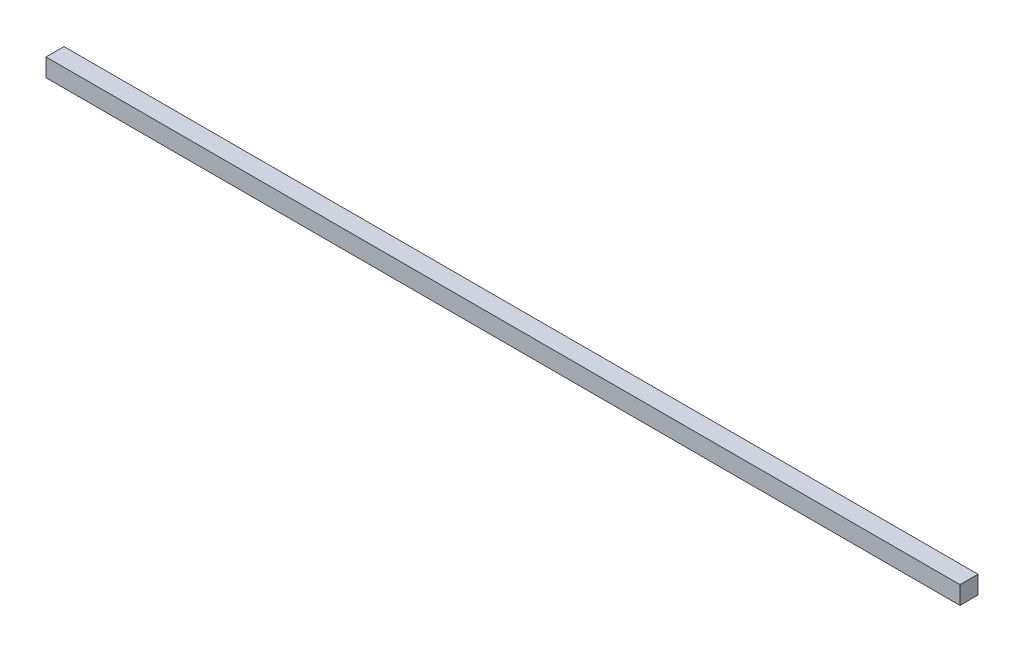
ISO-10303-21;
HEADER;
FILE_DESCRIPTION(('STEP AP214'),'2;1');
FILE_NAME('part.step','',(''),(''),'','','');
FILE_SCHEMA(('AUTOMOTIVE_DESIGN { 1 0 10303 214 1 1 1 1 }'));
ENDSEC;
DATA;
#1=APPLICATION_CONTEXT('core data for automotive mechanical design processes');
#2=APPLICATION_PROTOCOL_DEFINITION('international standard','automotive_design',2000,#1);
#3=PRODUCT_CONTEXT('',#1,'mechanical');
#4=PRODUCT('Part','Part','',(#3));
#5=PRODUCT_RELATED_PRODUCT_CATEGORY('part','',(#4));
#6=PRODUCT_DEFINITION_FORMATION('','',#4);
#7=PRODUCT_DEFINITION_CONTEXT('part definition',#1,'design');
#8=PRODUCT_DEFINITION('design','',#6,#7);
#9=PRODUCT_DEFINITION_SHAPE('','',#8);
#10=(LENGTH_UNIT() NAMED_UNIT(*) SI_UNIT(.MILLI.,.METRE.));
#11=(NAMED_UNIT(*) PLANE_ANGLE_UNIT() SI_UNIT($,.RADIAN.));
#12=(NAMED_UNIT(*) SI_UNIT($,.STERADIAN.) SOLID_ANGLE_UNIT());
#13=UNCERTAINTY_MEASURE_WITH_UNIT(LENGTH_MEASURE(1.E-05),#10,'distance_accuracy_value','');
#14=(GEOMETRIC_REPRESENTATION_CONTEXT(3) GLOBAL_UNCERTAINTY_ASSIGNED_CONTEXT((#13)) GLOBAL_UNIT_ASSIGNED_CONTEXT((#10,
#11,#12)) REPRESENTATION_CONTEXT('',''));
#15=CARTESIAN_POINT('',(0.,0.,0.));
#16=DIRECTION('',(0.,0.,1.));
#17=DIRECTION('',(1.,0.,0.));
#18=AXIS2_PLACEMENT_3D('',#15,#16,#17);
#19=CARTESIAN_POINT('',(304.5,0.,0.));
#20=DIRECTION('',(0.,0.,-1.));
#21=DIRECTION('',(-1.,0.,0.));
#22=AXIS2_PLACEMENT_3D('',#19,#20,#21);
#23=PLANE('',#22);
#24=DIRECTION('',(0.,-1.,0.));
#25=VECTOR('',#24,1.);
#26=CARTESIAN_POINT('',(0.,0.,0.));
#27=LINE('',#26,#25);
#28=CARTESIAN_POINT('',(0.,6.,0.));
#29=VERTEX_POINT('',#28);
#30=CARTESIAN_POINT('',(0.,0.,0.));
#31=VERTEX_POINT('',#30);
#32=EDGE_CURVE('E111',#29,#31,#27,.T.);
#33=ORIENTED_EDGE('',*,*,#32,.T.);
#34=DIRECTION('',(-1.,0.,0.));
#35=VECTOR('',#34,1.);
#36=CARTESIAN_POINT('',(304.5,0.,0.));
#37=LINE('',#36,#35);
#38=CARTESIAN_POINT('',(304.5,0.,0.));
#39=VERTEX_POINT('',#38);
#40=EDGE_CURVE('E11',#39,#31,#37,.T.);
#41=ORIENTED_EDGE('',*,*,#40,.F.);
#42=DIRECTION('',(0.,-1.,0.));
#43=VECTOR('',#42,1.);
#44=CARTESIAN_POINT('',(304.5,0.,0.));
#45=LINE('',#44,#43);
#46=CARTESIAN_POINT('',(304.5,6.,0.));
#47=VERTEX_POINT('',#46);
#48=EDGE_CURVE('E95',#47,#39,#45,.T.);
#49=ORIENTED_EDGE('',*,*,#48,.F.);
#50=DIRECTION('',(-1.,0.,0.));
#51=VECTOR('',#50,1.);
#52=CARTESIAN_POINT('',(304.5,6.,0.));
#53=LINE('',#52,#51);
#54=EDGE_CURVE('E107',#47,#29,#53,.T.);
#55=ORIENTED_EDGE('',*,*,#54,.T.);
#56=EDGE_LOOP('',(#33,#41,#49,#55));
#57=FACE_BOUND('',#56,.T.);
#58=ADVANCED_FACE('F43',(#57),#23,.F.);
#59=CARTESIAN_POINT('',(304.5,0.,0.));
#60=DIRECTION('',(0.,1.,0.));
#61=DIRECTION('',(0.,0.,1.));
#62=AXIS2_PLACEMENT_3D('',#59,#60,#61);
#63=PLANE('',#62);
#64=DIRECTION('',(0.,0.,-1.));
#65=VECTOR('',#64,1.);
#66=CARTESIAN_POINT('',(0.,0.,0.));
#67=LINE('',#66,#65);
#68=CARTESIAN_POINT('',(0.,0.,-6.));
#69=VERTEX_POINT('',#68);
#70=EDGE_CURVE('E100',#31,#69,#67,.T.);
#71=ORIENTED_EDGE('',*,*,#70,.T.);
#72=DIRECTION('',(-1.,0.,0.));
#73=VECTOR('',#72,1.);
#74=CARTESIAN_POINT('',(304.5,0.,-6.));
#75=LINE('',#74,#73);
#76=CARTESIAN_POINT('',(304.5,0.,-6.));
#77=VERTEX_POINT('',#76);
#78=EDGE_CURVE('E52',#77,#69,#75,.T.);
#79=ORIENTED_EDGE('',*,*,#78,.F.);
#80=DIRECTION('',(0.,0.,-1.));
#81=VECTOR('',#80,1.);
#82=CARTESIAN_POINT('',(304.5,0.,0.));
#83=LINE('',#82,#81);
#84=EDGE_CURVE('E90',#39,#77,#83,.T.);
#85=ORIENTED_EDGE('',*,*,#84,.F.);
#86=ORIENTED_EDGE('',*,*,#40,.T.);
#87=EDGE_LOOP('',(#71,#79,#85,#86));
#88=FACE_BOUND('',#87,.T.);
#89=ADVANCED_FACE('F99',(#88),#63,.F.);
#90=CARTESIAN_POINT('',(304.5,0.,-6.));
#91=DIRECTION('',(0.,0.,1.));
#92=DIRECTION('',(1.,0.,0.));
#93=AXIS2_PLACEMENT_3D('',#90,#91,#92);
#94=PLANE('',#93);
#95=DIRECTION('',(0.,1.,0.));
#96=VECTOR('',#95,1.);
#97=CARTESIAN_POINT('',(0.,0.,-6.));
#98=LINE('',#97,#96);
#99=CARTESIAN_POINT('',(0.,6.,-6.));
#100=VERTEX_POINT('',#99);
#101=EDGE_CURVE('E77',#69,#100,#98,.T.);
#102=ORIENTED_EDGE('',*,*,#101,.T.);
#103=DIRECTION('',(-1.,0.,0.));
#104=VECTOR('',#103,1.);
#105=CARTESIAN_POINT('',(304.5,6.,-6.));
#106=LINE('',#105,#104);
#107=CARTESIAN_POINT('',(304.5,6.,-6.));
#108=VERTEX_POINT('',#107);
#109=EDGE_CURVE('E102',#108,#100,#106,.T.);
#110=ORIENTED_EDGE('',*,*,#109,.F.);
#111=DIRECTION('',(0.,1.,0.));
#112=VECTOR('',#111,1.);
#113=CARTESIAN_POINT('',(304.5,0.,-6.));
#114=LINE('',#113,#112);
#115=EDGE_CURVE('E93',#77,#108,#114,.T.);
#116=ORIENTED_EDGE('',*,*,#115,.F.);
#117=ORIENTED_EDGE('',*,*,#78,.T.);
#118=EDGE_LOOP('',(#102,#110,#116,#117));
#119=FACE_BOUND('',#118,.T.);
#120=ADVANCED_FACE('F103',(#119),#94,.F.);
#121=CARTESIAN_POINT('',(304.5,6.,0.));
#122=DIRECTION('',(0.,-1.,0.));
#123=DIRECTION('',(0.,0.,-1.));
#124=AXIS2_PLACEMENT_3D('',#121,#122,#123);
#125=PLANE('',#124);
#126=DIRECTION('',(0.,0.,1.));
#127=VECTOR('',#126,1.);
#128=CARTESIAN_POINT('',(0.,6.,0.));
#129=LINE('',#128,#127);
#130=EDGE_CURVE('E83',#100,#29,#129,.T.);
#131=ORIENTED_EDGE('',*,*,#130,.T.);
#132=ORIENTED_EDGE('',*,*,#54,.F.);
#133=DIRECTION('',(0.,0.,1.));
#134=VECTOR('',#133,1.);
#135=CARTESIAN_POINT('',(304.5,6.,0.));
#136=LINE('',#135,#134);
#137=EDGE_CURVE('E60',#108,#47,#136,.T.);
#138=ORIENTED_EDGE('',*,*,#137,.F.);
#139=ORIENTED_EDGE('',*,*,#109,.T.);
#140=EDGE_LOOP('',(#131,#132,#138,#139));
#141=FACE_BOUND('',#140,.T.);
#142=ADVANCED_FACE('F124',(#141),#125,.F.);
#143=CARTESIAN_POINT('',(304.5,0.,0.));
#144=DIRECTION('',(-1.,0.,0.));
#145=DIRECTION('',(0.,0.,1.));
#146=AXIS2_PLACEMENT_3D('',#143,#144,#145);
#147=PLANE('',#146);
#148=ORIENTED_EDGE('',*,*,#48,.T.);
#149=ORIENTED_EDGE('',*,*,#84,.T.);
#150=ORIENTED_EDGE('',*,*,#115,.T.);
#151=ORIENTED_EDGE('',*,*,#137,.T.);
#152=EDGE_LOOP('',(#148,#149,#150,#151));
#153=FACE_BOUND('',#152,.T.);
#154=ADVANCED_FACE('F91',(#153),#147,.F.);
#155=CARTESIAN_POINT('',(0.,0.,0.));
#156=DIRECTION('',(-1.,0.,0.));
#157=DIRECTION('',(0.,0.,1.));
#158=AXIS2_PLACEMENT_3D('',#155,#156,#157);
#159=PLANE('',#158);
#160=ORIENTED_EDGE('',*,*,#32,.F.);
#161=ORIENTED_EDGE('',*,*,#130,.F.);
#162=ORIENTED_EDGE('',*,*,#101,.F.);
#163=ORIENTED_EDGE('',*,*,#70,.F.);
#164=EDGE_LOOP('',(#160,#161,#162,#163));
#165=FACE_BOUND('',#164,.T.);
#166=ADVANCED_FACE('F127',(#165),#159,.T.);
#167=CLOSED_SHELL('',(#58,#89,#120,#142,#154,#166));
#168=MANIFOLD_SOLID_BREP('B2',#167);
#169=ADVANCED_BREP_SHAPE_REPRESENTATION('',(#18,#168),#14);
#170=SHAPE_DEFINITION_REPRESENTATION(#9,#169);
ENDSEC;
END-ISO-10303-21;
